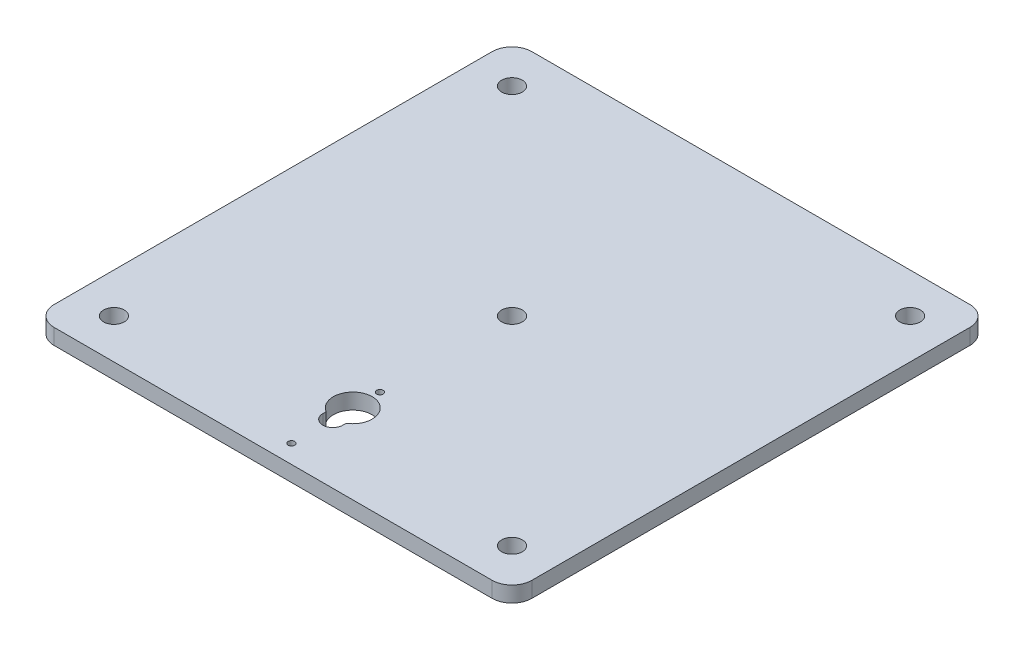
ISO-10303-21;
HEADER;
FILE_DESCRIPTION(('STEP AP214'),'2;1');
FILE_NAME('part.step','',(''),(''),'','','');
FILE_SCHEMA(('AUTOMOTIVE_DESIGN { 1 0 10303 214 1 1 1 1 }'));
ENDSEC;
DATA;
#1=APPLICATION_CONTEXT('core data for automotive mechanical design processes');
#2=APPLICATION_PROTOCOL_DEFINITION('international standard','automotive_design',2000,#1);
#3=PRODUCT_CONTEXT('',#1,'mechanical');
#4=PRODUCT('Part','Part','',(#3));
#5=PRODUCT_RELATED_PRODUCT_CATEGORY('part','',(#4));
#6=PRODUCT_DEFINITION_FORMATION('','',#4);
#7=PRODUCT_DEFINITION_CONTEXT('part definition',#1,'design');
#8=PRODUCT_DEFINITION('design','',#6,#7);
#9=PRODUCT_DEFINITION_SHAPE('','',#8);
#10=(LENGTH_UNIT() NAMED_UNIT(*) SI_UNIT(.MILLI.,.METRE.));
#11=(NAMED_UNIT(*) PLANE_ANGLE_UNIT() SI_UNIT($,.RADIAN.));
#12=(NAMED_UNIT(*) SI_UNIT($,.STERADIAN.) SOLID_ANGLE_UNIT());
#13=UNCERTAINTY_MEASURE_WITH_UNIT(LENGTH_MEASURE(1.E-05),#10,'distance_accuracy_value','');
#14=(GEOMETRIC_REPRESENTATION_CONTEXT(3) GLOBAL_UNCERTAINTY_ASSIGNED_CONTEXT((#13)) GLOBAL_UNIT_ASSIGNED_CONTEXT((#10,
#11,#12)) REPRESENTATION_CONTEXT('',''));
#15=CARTESIAN_POINT('',(0.,0.,0.));
#16=DIRECTION('',(0.,0.,1.));
#17=DIRECTION('',(1.,0.,0.));
#18=AXIS2_PLACEMENT_3D('',#15,#16,#17);
#19=CARTESIAN_POINT('',(-69.85,5.,69.85));
#20=DIRECTION('',(0.,1.,0.));
#21=DIRECTION('',(0.,0.,1.));
#22=AXIS2_PLACEMENT_3D('',#19,#20,#21);
#23=PLANE('',#22);
#24=CARTESIAN_POINT('',(0.,5.,42.125));
#25=DIRECTION('',(0.,1.,0.));
#26=DIRECTION('',(0.,0.,1.));
#27=AXIS2_PLACEMENT_3D('',#24,#25,#26);
#28=CIRCLE('',#27,1.05);
#29=CARTESIAN_POINT('',(0.,5.,43.175));
#30=VERTEX_POINT('',#29);
#31=EDGE_CURVE('E150',#30,#30,#28,.T.);
#32=ORIENTED_EDGE('',*,*,#31,.F.);
#33=EDGE_LOOP('',(#32));
#34=FACE_BOUND('',#33,.T.);
#35=CARTESIAN_POINT('',(-63.5,5.,-63.5));
#36=DIRECTION('',(0.,1.,0.));
#37=DIRECTION('',(0.,0.,-1.));
#38=AXIS2_PLACEMENT_3D('',#35,#36,#37);
#39=CIRCLE('',#38,3.302);
#40=CARTESIAN_POINT('',(-63.5,5.,-66.802));
#41=VERTEX_POINT('',#40);
#42=EDGE_CURVE('E166',#41,#41,#39,.T.);
#43=ORIENTED_EDGE('',*,*,#42,.F.);
#44=EDGE_LOOP('',(#43));
#45=FACE_BOUND('',#44,.T.);
#46=CARTESIAN_POINT('',(63.5000000000001,5.,63.5));
#47=DIRECTION('',(0.,1.,0.));
#48=DIRECTION('',(0.,0.,-1.));
#49=AXIS2_PLACEMENT_3D('',#46,#47,#48);
#50=CIRCLE('',#49,3.302);
#51=CARTESIAN_POINT('',(63.5000000000001,5.,60.198));
#52=VERTEX_POINT('',#51);
#53=EDGE_CURVE('E178',#52,#52,#50,.T.);
#54=ORIENTED_EDGE('',*,*,#53,.F.);
#55=EDGE_LOOP('',(#54));
#56=FACE_BOUND('',#55,.T.);
#57=CARTESIAN_POINT('',(-69.85,5.,69.85));
#58=DIRECTION('',(0.,1.,0.));
#59=DIRECTION('',(0.,0.,1.));
#60=AXIS2_PLACEMENT_3D('',#57,#58,#59);
#61=CIRCLE('',#60,6.34999999999999);
#62=CARTESIAN_POINT('',(-76.2,5.,69.85));
#63=VERTEX_POINT('',#62);
#64=CARTESIAN_POINT('',(-69.85,5.,76.2));
#65=VERTEX_POINT('',#64);
#66=EDGE_CURVE('E190',#63,#65,#61,.T.);
#67=ORIENTED_EDGE('',*,*,#66,.T.);
#68=DIRECTION('',(1.,0.,0.));
#69=VECTOR('',#68,1.);
#70=CARTESIAN_POINT('',(-69.85,5.,76.2));
#71=LINE('',#70,#69);
#72=CARTESIAN_POINT('',(69.85,5.,76.2));
#73=VERTEX_POINT('',#72);
#74=EDGE_CURVE('E193',#65,#73,#71,.T.);
#75=ORIENTED_EDGE('',*,*,#74,.T.);
#76=CARTESIAN_POINT('',(69.85,5.,69.85));
#77=DIRECTION('',(0.,1.,0.));
#78=DIRECTION('',(0.,0.,1.));
#79=AXIS2_PLACEMENT_3D('',#76,#77,#78);
#80=CIRCLE('',#79,6.34999999999999);
#81=CARTESIAN_POINT('',(76.2,5.,69.85));
#82=VERTEX_POINT('',#81);
#83=EDGE_CURVE('E196',#73,#82,#80,.T.);
#84=ORIENTED_EDGE('',*,*,#83,.T.);
#85=DIRECTION('',(0.,0.,-1.));
#86=VECTOR('',#85,1.);
#87=CARTESIAN_POINT('',(76.2,5.,-69.85));
#88=LINE('',#87,#86);
#89=CARTESIAN_POINT('',(76.2,5.,-69.85));
#90=VERTEX_POINT('',#89);
#91=EDGE_CURVE('E198',#82,#90,#88,.T.);
#92=ORIENTED_EDGE('',*,*,#91,.T.);
#93=CARTESIAN_POINT('',(69.85,5.,-69.85));
#94=DIRECTION('',(0.,1.,0.));
#95=DIRECTION('',(0.,0.,-1.));
#96=AXIS2_PLACEMENT_3D('',#93,#94,#95);
#97=CIRCLE('',#96,6.34999999999999);
#98=CARTESIAN_POINT('',(69.8499999999999,5.,-76.2));
#99=VERTEX_POINT('',#98);
#100=EDGE_CURVE('E200',#90,#99,#97,.T.);
#101=ORIENTED_EDGE('',*,*,#100,.T.);
#102=DIRECTION('',(-1.,0.,0.));
#103=VECTOR('',#102,1.);
#104=CARTESIAN_POINT('',(-69.85,5.,-76.2));
#105=LINE('',#104,#103);
#106=CARTESIAN_POINT('',(-69.85,5.,-76.2));
#107=VERTEX_POINT('',#106);
#108=EDGE_CURVE('E202',#99,#107,#105,.T.);
#109=ORIENTED_EDGE('',*,*,#108,.T.);
#110=CARTESIAN_POINT('',(-69.8500000000001,5.,-69.85));
#111=DIRECTION('',(0.,1.,0.));
#112=DIRECTION('',(0.,0.,1.));
#113=AXIS2_PLACEMENT_3D('',#110,#111,#112);
#114=CIRCLE('',#113,6.34999999999999);
#115=CARTESIAN_POINT('',(-76.2,5.,-69.85));
#116=VERTEX_POINT('',#115);
#117=EDGE_CURVE('E204',#107,#116,#114,.T.);
#118=ORIENTED_EDGE('',*,*,#117,.T.);
#119=DIRECTION('',(0.,0.,1.));
#120=VECTOR('',#119,1.);
#121=CARTESIAN_POINT('',(-76.2,5.,-69.85));
#122=LINE('',#121,#120);
#123=EDGE_CURVE('E206',#116,#63,#122,.T.);
#124=ORIENTED_EDGE('',*,*,#123,.T.);
#125=EDGE_LOOP('',(#67,#75,#84,#92,#101,#109,#118,#124));
#126=FACE_BOUND('',#125,.T.);
#127=CARTESIAN_POINT('',(63.5000000000001,5.,-63.5));
#128=DIRECTION('',(0.,1.,0.));
#129=DIRECTION('',(0.,0.,1.));
#130=AXIS2_PLACEMENT_3D('',#127,#128,#129);
#131=CIRCLE('',#130,3.302);
#132=CARTESIAN_POINT('',(63.5000000000001,5.,-60.198));
#133=VERTEX_POINT('',#132);
#134=EDGE_CURVE('E184',#133,#133,#131,.T.);
#135=ORIENTED_EDGE('',*,*,#134,.F.);
#136=EDGE_LOOP('',(#135));
#137=FACE_BOUND('',#136,.T.);
#138=CARTESIAN_POINT('',(-63.5,5.,63.5));
#139=DIRECTION('',(0.,1.,0.));
#140=DIRECTION('',(0.,0.,1.));
#141=AXIS2_PLACEMENT_3D('',#138,#139,#140);
#142=CIRCLE('',#141,3.302);
#143=CARTESIAN_POINT('',(-63.5,5.,66.802));
#144=VERTEX_POINT('',#143);
#145=EDGE_CURVE('E172',#144,#144,#142,.T.);
#146=ORIENTED_EDGE('',*,*,#145,.F.);
#147=EDGE_LOOP('',(#146));
#148=FACE_BOUND('',#147,.T.);
#149=CARTESIAN_POINT('',(0.,5.,0.));
#150=DIRECTION('',(0.,1.,0.));
#151=DIRECTION('',(0.,0.,1.));
#152=AXIS2_PLACEMENT_3D('',#149,#150,#151);
#153=CIRCLE('',#152,3.302);
#154=CARTESIAN_POINT('',(0.,5.,3.30199999999997));
#155=VERTEX_POINT('',#154);
#156=EDGE_CURVE('E160',#155,#155,#153,.T.);
#157=ORIENTED_EDGE('',*,*,#156,.F.);
#158=EDGE_LOOP('',(#157));
#159=FACE_BOUND('',#158,.T.);
#160=DIRECTION('',(0.,0.,1.));
#161=VECTOR('',#160,1.);
#162=CARTESIAN_POINT('',(-3.20000000000003,5.,56.1103672189407));
#163=LINE('',#162,#161);
#164=CARTESIAN_POINT('',(-3.20000000000003,5.,56.1103672189407));
#165=VERTEX_POINT('',#164);
#166=CARTESIAN_POINT('',(-3.20000000000003,5.,57.15));
#167=VERTEX_POINT('',#166);
#168=EDGE_CURVE('E129',#165,#167,#163,.T.);
#169=ORIENTED_EDGE('',*,*,#168,.F.);
#170=CARTESIAN_POINT('',(0.,5.,50.8));
#171=DIRECTION('',(0.,1.,0.));
#172=DIRECTION('',(0.,0.,1.));
#173=AXIS2_PLACEMENT_3D('',#170,#171,#172);
#174=CIRCLE('',#173,6.2);
#175=CARTESIAN_POINT('',(3.19999999999997,5.,56.1103672189407));
#176=VERTEX_POINT('',#175);
#177=EDGE_CURVE('E121',#176,#165,#174,.T.);
#178=ORIENTED_EDGE('',*,*,#177,.F.);
#179=DIRECTION('',(0.,0.,-1.));
#180=VECTOR('',#179,1.);
#181=CARTESIAN_POINT('',(3.19999999999997,5.,56.1103672189407));
#182=LINE('',#181,#180);
#183=CARTESIAN_POINT('',(3.19999999999997,5.,57.15));
#184=VERTEX_POINT('',#183);
#185=EDGE_CURVE('E144',#184,#176,#182,.T.);
#186=ORIENTED_EDGE('',*,*,#185,.F.);
#187=CARTESIAN_POINT('',(0.,5.,57.15));
#188=DIRECTION('',(0.,1.,0.));
#189=DIRECTION('',(0.,0.,1.));
#190=AXIS2_PLACEMENT_3D('',#187,#188,#189);
#191=CIRCLE('',#190,3.2);
#192=EDGE_CURVE('E142',#167,#184,#191,.T.);
#193=ORIENTED_EDGE('',*,*,#192,.F.);
#194=EDGE_LOOP('',(#169,#178,#186,#193));
#195=FACE_BOUND('',#194,.T.);
#196=CARTESIAN_POINT('',(0.,5.,70.375));
#197=DIRECTION('',(0.,1.,0.));
#198=DIRECTION('',(0.,0.,1.));
#199=AXIS2_PLACEMENT_3D('',#196,#197,#198);
#200=CIRCLE('',#199,1.05);
#201=CARTESIAN_POINT('',(0.,5.,71.425));
#202=VERTEX_POINT('',#201);
#203=EDGE_CURVE('E374',#202,#202,#200,.T.);
#204=ORIENTED_EDGE('',*,*,#203,.F.);
#205=EDGE_LOOP('',(#204));
#206=FACE_BOUND('',#205,.T.);
#207=ADVANCED_FACE('F32',(#34,#45,#56,#126,#137,#148,#159,#195,#206),#23,.T.);
#208=CARTESIAN_POINT('',(-69.85,0.,69.85));
#209=DIRECTION('',(0.,1.,0.));
#210=DIRECTION('',(0.,0.,1.));
#211=AXIS2_PLACEMENT_3D('',#208,#209,#210);
#212=PLANE('',#211);
#213=CARTESIAN_POINT('',(0.,0.,0.));
#214=DIRECTION('',(0.,1.,0.));
#215=DIRECTION('',(0.,0.,1.));
#216=AXIS2_PLACEMENT_3D('',#213,#214,#215);
#217=CIRCLE('',#216,3.302);
#218=CARTESIAN_POINT('',(0.,0.,3.30199999999997));
#219=VERTEX_POINT('',#218);
#220=EDGE_CURVE('E137',#219,#219,#217,.T.);
#221=ORIENTED_EDGE('',*,*,#220,.T.);
#222=EDGE_LOOP('',(#221));
#223=FACE_BOUND('',#222,.T.);
#224=CARTESIAN_POINT('',(-63.5,0.,-63.5));
#225=DIRECTION('',(0.,1.,0.));
#226=DIRECTION('',(0.,0.,-1.));
#227=AXIS2_PLACEMENT_3D('',#224,#225,#226);
#228=CIRCLE('',#227,3.302);
#229=CARTESIAN_POINT('',(-63.5,0.,-66.802));
#230=VERTEX_POINT('',#229);
#231=EDGE_CURVE('E163',#230,#230,#228,.T.);
#232=ORIENTED_EDGE('',*,*,#231,.T.);
#233=EDGE_LOOP('',(#232));
#234=FACE_BOUND('',#233,.T.);
#235=CARTESIAN_POINT('',(-63.5,0.,63.5));
#236=DIRECTION('',(0.,1.,0.));
#237=DIRECTION('',(0.,0.,1.));
#238=AXIS2_PLACEMENT_3D('',#235,#236,#237);
#239=CIRCLE('',#238,3.302);
#240=CARTESIAN_POINT('',(-63.5,0.,66.802));
#241=VERTEX_POINT('',#240);
#242=EDGE_CURVE('E169',#241,#241,#239,.T.);
#243=ORIENTED_EDGE('',*,*,#242,.T.);
#244=EDGE_LOOP('',(#243));
#245=FACE_BOUND('',#244,.T.);
#246=CARTESIAN_POINT('',(63.5000000000001,0.,63.5));
#247=DIRECTION('',(0.,1.,0.));
#248=DIRECTION('',(0.,0.,-1.));
#249=AXIS2_PLACEMENT_3D('',#246,#247,#248);
#250=CIRCLE('',#249,3.302);
#251=CARTESIAN_POINT('',(63.5000000000001,0.,60.198));
#252=VERTEX_POINT('',#251);
#253=EDGE_CURVE('E175',#252,#252,#250,.T.);
#254=ORIENTED_EDGE('',*,*,#253,.T.);
#255=EDGE_LOOP('',(#254));
#256=FACE_BOUND('',#255,.T.);
#257=CARTESIAN_POINT('',(63.5000000000001,0.,-63.5));
#258=DIRECTION('',(0.,1.,0.));
#259=DIRECTION('',(0.,0.,1.));
#260=AXIS2_PLACEMENT_3D('',#257,#258,#259);
#261=CIRCLE('',#260,3.302);
#262=CARTESIAN_POINT('',(63.5000000000001,0.,-60.198));
#263=VERTEX_POINT('',#262);
#264=EDGE_CURVE('E181',#263,#263,#261,.T.);
#265=ORIENTED_EDGE('',*,*,#264,.T.);
#266=EDGE_LOOP('',(#265));
#267=FACE_BOUND('',#266,.T.);
#268=CARTESIAN_POINT('',(-69.85,0.,69.85));
#269=DIRECTION('',(0.,1.,0.));
#270=DIRECTION('',(0.,0.,1.));
#271=AXIS2_PLACEMENT_3D('',#268,#269,#270);
#272=CIRCLE('',#271,6.34999999999999);
#273=CARTESIAN_POINT('',(-76.2,0.,69.85));
#274=VERTEX_POINT('',#273);
#275=CARTESIAN_POINT('',(-69.85,0.,76.2));
#276=VERTEX_POINT('',#275);
#277=EDGE_CURVE('E187',#274,#276,#272,.T.);
#278=ORIENTED_EDGE('',*,*,#277,.F.);
#279=DIRECTION('',(0.,0.,1.));
#280=VECTOR('',#279,1.);
#281=CARTESIAN_POINT('',(-76.2,0.,-69.85));
#282=LINE('',#281,#280);
#283=CARTESIAN_POINT('',(-76.2,0.,-69.85));
#284=VERTEX_POINT('',#283);
#285=EDGE_CURVE('E194',#284,#274,#282,.T.);
#286=ORIENTED_EDGE('',*,*,#285,.F.);
#287=CARTESIAN_POINT('',(-69.8500000000001,0.,-69.85));
#288=DIRECTION('',(0.,1.,0.));
#289=DIRECTION('',(0.,0.,1.));
#290=AXIS2_PLACEMENT_3D('',#287,#288,#289);
#291=CIRCLE('',#290,6.34999999999999);
#292=CARTESIAN_POINT('',(-69.85,0.,-76.2));
#293=VERTEX_POINT('',#292);
#294=EDGE_CURVE('E221',#293,#284,#291,.T.);
#295=ORIENTED_EDGE('',*,*,#294,.F.);
#296=DIRECTION('',(-1.,0.,0.));
#297=VECTOR('',#296,1.);
#298=CARTESIAN_POINT('',(-69.85,0.,-76.2));
#299=LINE('',#298,#297);
#300=CARTESIAN_POINT('',(69.8499999999999,0.,-76.2));
#301=VERTEX_POINT('',#300);
#302=EDGE_CURVE('E219',#301,#293,#299,.T.);
#303=ORIENTED_EDGE('',*,*,#302,.F.);
#304=CARTESIAN_POINT('',(69.85,0.,-69.85));
#305=DIRECTION('',(0.,1.,0.));
#306=DIRECTION('',(0.,0.,-1.));
#307=AXIS2_PLACEMENT_3D('',#304,#305,#306);
#308=CIRCLE('',#307,6.34999999999999);
#309=CARTESIAN_POINT('',(76.2,0.,-69.85));
#310=VERTEX_POINT('',#309);
#311=EDGE_CURVE('E217',#310,#301,#308,.T.);
#312=ORIENTED_EDGE('',*,*,#311,.F.);
#313=DIRECTION('',(0.,0.,-1.));
#314=VECTOR('',#313,1.);
#315=CARTESIAN_POINT('',(76.2,0.,-69.85));
#316=LINE('',#315,#314);
#317=CARTESIAN_POINT('',(76.2,0.,69.85));
#318=VERTEX_POINT('',#317);
#319=EDGE_CURVE('E215',#318,#310,#316,.T.);
#320=ORIENTED_EDGE('',*,*,#319,.F.);
#321=CARTESIAN_POINT('',(69.85,0.,69.85));
#322=DIRECTION('',(0.,1.,0.));
#323=DIRECTION('',(0.,0.,1.));
#324=AXIS2_PLACEMENT_3D('',#321,#322,#323);
#325=CIRCLE('',#324,6.34999999999999);
#326=CARTESIAN_POINT('',(69.85,0.,76.2));
#327=VERTEX_POINT('',#326);
#328=EDGE_CURVE('E213',#327,#318,#325,.T.);
#329=ORIENTED_EDGE('',*,*,#328,.F.);
#330=DIRECTION('',(1.,0.,0.));
#331=VECTOR('',#330,1.);
#332=CARTESIAN_POINT('',(-69.85,0.,76.2));
#333=LINE('',#332,#331);
#334=EDGE_CURVE('E211',#276,#327,#333,.T.);
#335=ORIENTED_EDGE('',*,*,#334,.F.);
#336=EDGE_LOOP('',(#278,#286,#295,#303,#312,#320,#329,#335));
#337=FACE_BOUND('',#336,.T.);
#338=CARTESIAN_POINT('',(0.,0.,50.8));
#339=DIRECTION('',(0.,1.,0.));
#340=DIRECTION('',(0.,0.,1.));
#341=AXIS2_PLACEMENT_3D('',#338,#339,#340);
#342=CIRCLE('',#341,6.2);
#343=CARTESIAN_POINT('',(3.19999999999997,0.,56.1103672189407));
#344=VERTEX_POINT('',#343);
#345=CARTESIAN_POINT('',(-3.20000000000003,0.,56.1103672189407));
#346=VERTEX_POINT('',#345);
#347=EDGE_CURVE('E55',#344,#346,#342,.T.);
#348=ORIENTED_EDGE('',*,*,#347,.T.);
#349=DIRECTION('',(0.,0.,1.));
#350=VECTOR('',#349,1.);
#351=CARTESIAN_POINT('',(-3.20000000000003,0.,56.1103672189407));
#352=LINE('',#351,#350);
#353=CARTESIAN_POINT('',(-3.20000000000003,0.,57.15));
#354=VERTEX_POINT('',#353);
#355=EDGE_CURVE('E136',#346,#354,#352,.T.);
#356=ORIENTED_EDGE('',*,*,#355,.T.);
#357=CARTESIAN_POINT('',(0.,0.,57.15));
#358=DIRECTION('',(0.,1.,0.));
#359=DIRECTION('',(0.,0.,1.));
#360=AXIS2_PLACEMENT_3D('',#357,#358,#359);
#361=CIRCLE('',#360,3.2);
#362=CARTESIAN_POINT('',(3.19999999999997,0.,57.15));
#363=VERTEX_POINT('',#362);
#364=EDGE_CURVE('E152',#354,#363,#361,.T.);
#365=ORIENTED_EDGE('',*,*,#364,.T.);
#366=DIRECTION('',(0.,0.,-1.));
#367=VECTOR('',#366,1.);
#368=CARTESIAN_POINT('',(3.19999999999997,0.,56.1103672189407));
#369=LINE('',#368,#367);
#370=EDGE_CURVE('E130',#363,#344,#369,.T.);
#371=ORIENTED_EDGE('',*,*,#370,.T.);
#372=EDGE_LOOP('',(#348,#356,#365,#371));
#373=FACE_BOUND('',#372,.T.);
#374=CARTESIAN_POINT('',(0.,0.,42.125));
#375=DIRECTION('',(0.,1.,0.));
#376=DIRECTION('',(0.,0.,1.));
#377=AXIS2_PLACEMENT_3D('',#374,#375,#376);
#378=CIRCLE('',#377,1.05);
#379=CARTESIAN_POINT('',(0.,0.,43.175));
#380=VERTEX_POINT('',#379);
#381=EDGE_CURVE('E372',#380,#380,#378,.T.);
#382=ORIENTED_EDGE('',*,*,#381,.T.);
#383=EDGE_LOOP('',(#382));
#384=FACE_BOUND('',#383,.T.);
#385=CARTESIAN_POINT('',(0.,0.,70.375));
#386=DIRECTION('',(0.,1.,0.));
#387=DIRECTION('',(0.,0.,1.));
#388=AXIS2_PLACEMENT_3D('',#385,#386,#387);
#389=CIRCLE('',#388,1.05);
#390=CARTESIAN_POINT('',(0.,0.,71.425));
#391=VERTEX_POINT('',#390);
#392=EDGE_CURVE('E378',#391,#391,#389,.T.);
#393=ORIENTED_EDGE('',*,*,#392,.T.);
#394=EDGE_LOOP('',(#393));
#395=FACE_BOUND('',#394,.T.);
#396=ADVANCED_FACE('F251',(#223,#234,#245,#256,#267,#337,#373,#384,#395),#212,.F.);
#397=CARTESIAN_POINT('',(-69.85,5.,69.85));
#398=DIRECTION('',(0.,-1.,0.));
#399=DIRECTION('',(0.,0.,-1.));
#400=AXIS2_PLACEMENT_3D('',#397,#398,#399);
#401=CYLINDRICAL_SURFACE('',#400,6.34999999999999);
#402=ORIENTED_EDGE('',*,*,#277,.T.);
#403=DIRECTION('',(0.,-1.,0.));
#404=VECTOR('',#403,1.);
#405=CARTESIAN_POINT('',(-69.85,5.,76.2));
#406=LINE('',#405,#404);
#407=EDGE_CURVE('E11',#65,#276,#406,.T.);
#408=ORIENTED_EDGE('',*,*,#407,.F.);
#409=ORIENTED_EDGE('',*,*,#66,.F.);
#410=DIRECTION('',(0.,-1.,0.));
#411=VECTOR('',#410,1.);
#412=CARTESIAN_POINT('',(-76.2,5.,69.85));
#413=LINE('',#412,#411);
#414=EDGE_CURVE('E208',#63,#274,#413,.T.);
#415=ORIENTED_EDGE('',*,*,#414,.T.);
#416=EDGE_LOOP('',(#402,#408,#409,#415));
#417=FACE_BOUND('',#416,.T.);
#418=ADVANCED_FACE('F34',(#417),#401,.T.);
#419=CARTESIAN_POINT('',(-69.85,5.,76.2));
#420=DIRECTION('',(0.,0.,-1.));
#421=DIRECTION('',(-1.,0.,0.));
#422=AXIS2_PLACEMENT_3D('',#419,#420,#421);
#423=PLANE('',#422);
#424=ORIENTED_EDGE('',*,*,#334,.T.);
#425=DIRECTION('',(0.,-1.,0.));
#426=VECTOR('',#425,1.);
#427=CARTESIAN_POINT('',(69.85,5.,76.2));
#428=LINE('',#427,#426);
#429=EDGE_CURVE('E40',#73,#327,#428,.T.);
#430=ORIENTED_EDGE('',*,*,#429,.F.);
#431=ORIENTED_EDGE('',*,*,#74,.F.);
#432=ORIENTED_EDGE('',*,*,#407,.T.);
#433=EDGE_LOOP('',(#424,#430,#431,#432));
#434=FACE_BOUND('',#433,.T.);
#435=ADVANCED_FACE('F269',(#434),#423,.F.);
#436=CARTESIAN_POINT('',(69.85,5.,69.85));
#437=DIRECTION('',(0.,-1.,0.));
#438=DIRECTION('',(0.,0.,-1.));
#439=AXIS2_PLACEMENT_3D('',#436,#437,#438);
#440=CYLINDRICAL_SURFACE('',#439,6.34999999999999);
#441=ORIENTED_EDGE('',*,*,#328,.T.);
#442=DIRECTION('',(0.,-1.,0.));
#443=VECTOR('',#442,1.);
#444=CARTESIAN_POINT('',(76.2,5.,69.85));
#445=LINE('',#444,#443);
#446=EDGE_CURVE('E238',#82,#318,#445,.T.);
#447=ORIENTED_EDGE('',*,*,#446,.F.);
#448=ORIENTED_EDGE('',*,*,#83,.F.);
#449=ORIENTED_EDGE('',*,*,#429,.T.);
#450=EDGE_LOOP('',(#441,#447,#448,#449));
#451=FACE_BOUND('',#450,.T.);
#452=ADVANCED_FACE('F245',(#451),#440,.T.);
#453=CARTESIAN_POINT('',(76.2,5.,-69.85));
#454=DIRECTION('',(-1.,0.,0.));
#455=DIRECTION('',(0.,0.,1.));
#456=AXIS2_PLACEMENT_3D('',#453,#454,#455);
#457=PLANE('',#456);
#458=ORIENTED_EDGE('',*,*,#319,.T.);
#459=DIRECTION('',(0.,-1.,0.));
#460=VECTOR('',#459,1.);
#461=CARTESIAN_POINT('',(76.2,5.,-69.85));
#462=LINE('',#461,#460);
#463=EDGE_CURVE('E235',#90,#310,#462,.T.);
#464=ORIENTED_EDGE('',*,*,#463,.F.);
#465=ORIENTED_EDGE('',*,*,#91,.F.);
#466=ORIENTED_EDGE('',*,*,#446,.T.);
#467=EDGE_LOOP('',(#458,#464,#465,#466));
#468=FACE_BOUND('',#467,.T.);
#469=ADVANCED_FACE('F257',(#468),#457,.F.);
#470=CARTESIAN_POINT('',(69.85,5.,-69.85));
#471=DIRECTION('',(0.,-1.,0.));
#472=DIRECTION('',(0.,0.,-1.));
#473=AXIS2_PLACEMENT_3D('',#470,#471,#472);
#474=CYLINDRICAL_SURFACE('',#473,6.34999999999999);
#475=ORIENTED_EDGE('',*,*,#311,.T.);
#476=DIRECTION('',(0.,-1.,0.));
#477=VECTOR('',#476,1.);
#478=CARTESIAN_POINT('',(69.8499999999999,5.,-76.2));
#479=LINE('',#478,#477);
#480=EDGE_CURVE('E232',#99,#301,#479,.T.);
#481=ORIENTED_EDGE('',*,*,#480,.F.);
#482=ORIENTED_EDGE('',*,*,#100,.F.);
#483=ORIENTED_EDGE('',*,*,#463,.T.);
#484=EDGE_LOOP('',(#475,#481,#482,#483));
#485=FACE_BOUND('',#484,.T.);
#486=ADVANCED_FACE('F261',(#485),#474,.T.);
#487=CARTESIAN_POINT('',(-69.85,5.,-76.2));
#488=DIRECTION('',(0.,0.,1.));
#489=DIRECTION('',(1.,0.,0.));
#490=AXIS2_PLACEMENT_3D('',#487,#488,#489);
#491=PLANE('',#490);
#492=ORIENTED_EDGE('',*,*,#302,.T.);
#493=DIRECTION('',(0.,-1.,0.));
#494=VECTOR('',#493,1.);
#495=CARTESIAN_POINT('',(-69.85,5.,-76.2));
#496=LINE('',#495,#494);
#497=EDGE_CURVE('E229',#107,#293,#496,.T.);
#498=ORIENTED_EDGE('',*,*,#497,.F.);
#499=ORIENTED_EDGE('',*,*,#108,.F.);
#500=ORIENTED_EDGE('',*,*,#480,.T.);
#501=EDGE_LOOP('',(#492,#498,#499,#500));
#502=FACE_BOUND('',#501,.T.);
#503=ADVANCED_FACE('F282',(#502),#491,.F.);
#504=CARTESIAN_POINT('',(-69.8500000000001,5.,-69.85));
#505=DIRECTION('',(0.,-1.,0.));
#506=DIRECTION('',(0.,0.,-1.));
#507=AXIS2_PLACEMENT_3D('',#504,#505,#506);
#508=CYLINDRICAL_SURFACE('',#507,6.34999999999999);
#509=ORIENTED_EDGE('',*,*,#294,.T.);
#510=DIRECTION('',(0.,-1.,0.));
#511=VECTOR('',#510,1.);
#512=CARTESIAN_POINT('',(-76.2,5.,-69.85));
#513=LINE('',#512,#511);
#514=EDGE_CURVE('E226',#116,#284,#513,.T.);
#515=ORIENTED_EDGE('',*,*,#514,.F.);
#516=ORIENTED_EDGE('',*,*,#117,.F.);
#517=ORIENTED_EDGE('',*,*,#497,.T.);
#518=EDGE_LOOP('',(#509,#515,#516,#517));
#519=FACE_BOUND('',#518,.T.);
#520=ADVANCED_FACE('F280',(#519),#508,.T.);
#521=CARTESIAN_POINT('',(-76.2,5.,-69.85));
#522=DIRECTION('',(1.,0.,0.));
#523=DIRECTION('',(0.,0.,-1.));
#524=AXIS2_PLACEMENT_3D('',#521,#522,#523);
#525=PLANE('',#524);
#526=ORIENTED_EDGE('',*,*,#285,.T.);
#527=ORIENTED_EDGE('',*,*,#414,.F.);
#528=ORIENTED_EDGE('',*,*,#123,.F.);
#529=ORIENTED_EDGE('',*,*,#514,.T.);
#530=EDGE_LOOP('',(#526,#527,#528,#529));
#531=FACE_BOUND('',#530,.T.);
#532=ADVANCED_FACE('F275',(#531),#525,.F.);
#533=CARTESIAN_POINT('',(63.5000000000001,5.,-63.5));
#534=DIRECTION('',(0.,-1.,0.));
#535=DIRECTION('',(0.,0.,-1.));
#536=AXIS2_PLACEMENT_3D('',#533,#534,#535);
#537=CYLINDRICAL_SURFACE('',#536,3.302);
#538=ORIENTED_EDGE('',*,*,#134,.T.);
#539=EDGE_LOOP('',(#538));
#540=FACE_BOUND('',#539,.T.);
#541=ORIENTED_EDGE('',*,*,#264,.F.);
#542=EDGE_LOOP('',(#541));
#543=FACE_BOUND('',#542,.T.);
#544=ADVANCED_FACE('F302',(#540,#543),#537,.F.);
#545=CARTESIAN_POINT('',(63.5000000000001,5.,63.5));
#546=DIRECTION('',(0.,-1.,0.));
#547=DIRECTION('',(0.,0.,-1.));
#548=AXIS2_PLACEMENT_3D('',#545,#546,#547);
#549=CYLINDRICAL_SURFACE('',#548,3.302);
#550=ORIENTED_EDGE('',*,*,#53,.T.);
#551=EDGE_LOOP('',(#550));
#552=FACE_BOUND('',#551,.T.);
#553=ORIENTED_EDGE('',*,*,#253,.F.);
#554=EDGE_LOOP('',(#553));
#555=FACE_BOUND('',#554,.T.);
#556=ADVANCED_FACE('F309',(#552,#555),#549,.F.);
#557=CARTESIAN_POINT('',(-63.5,5.,63.5));
#558=DIRECTION('',(0.,-1.,0.));
#559=DIRECTION('',(0.,0.,-1.));
#560=AXIS2_PLACEMENT_3D('',#557,#558,#559);
#561=CYLINDRICAL_SURFACE('',#560,3.302);
#562=ORIENTED_EDGE('',*,*,#145,.T.);
#563=EDGE_LOOP('',(#562));
#564=FACE_BOUND('',#563,.T.);
#565=ORIENTED_EDGE('',*,*,#242,.F.);
#566=EDGE_LOOP('',(#565));
#567=FACE_BOUND('',#566,.T.);
#568=ADVANCED_FACE('F314',(#564,#567),#561,.F.);
#569=CARTESIAN_POINT('',(-63.5,5.,-63.5));
#570=DIRECTION('',(0.,-1.,0.));
#571=DIRECTION('',(0.,0.,-1.));
#572=AXIS2_PLACEMENT_3D('',#569,#570,#571);
#573=CYLINDRICAL_SURFACE('',#572,3.302);
#574=ORIENTED_EDGE('',*,*,#42,.T.);
#575=EDGE_LOOP('',(#574));
#576=FACE_BOUND('',#575,.T.);
#577=ORIENTED_EDGE('',*,*,#231,.F.);
#578=EDGE_LOOP('',(#577));
#579=FACE_BOUND('',#578,.T.);
#580=ADVANCED_FACE('F328',(#576,#579),#573,.F.);
#581=CARTESIAN_POINT('',(0.,5.,0.));
#582=DIRECTION('',(0.,-1.,0.));
#583=DIRECTION('',(0.,0.,-1.));
#584=AXIS2_PLACEMENT_3D('',#581,#582,#583);
#585=CYLINDRICAL_SURFACE('',#584,3.302);
#586=ORIENTED_EDGE('',*,*,#156,.T.);
#587=EDGE_LOOP('',(#586));
#588=FACE_BOUND('',#587,.T.);
#589=ORIENTED_EDGE('',*,*,#220,.F.);
#590=EDGE_LOOP('',(#589));
#591=FACE_BOUND('',#590,.T.);
#592=ADVANCED_FACE('F325',(#588,#591),#585,.F.);
#593=CARTESIAN_POINT('',(0.,5.,50.8));
#594=DIRECTION('',(0.,-1.,0.));
#595=DIRECTION('',(0.,0.,-1.));
#596=AXIS2_PLACEMENT_3D('',#593,#594,#595);
#597=CYLINDRICAL_SURFACE('',#596,6.2);
#598=ORIENTED_EDGE('',*,*,#347,.F.);
#599=DIRECTION('',(0.,-1.,0.));
#600=VECTOR('',#599,1.);
#601=CARTESIAN_POINT('',(3.19999999999997,5.,56.1103672189407));
#602=LINE('',#601,#600);
#603=EDGE_CURVE('E125',#176,#344,#602,.T.);
#604=ORIENTED_EDGE('',*,*,#603,.F.);
#605=ORIENTED_EDGE('',*,*,#177,.T.);
#606=DIRECTION('',(0.,-1.,0.));
#607=VECTOR('',#606,1.);
#608=CARTESIAN_POINT('',(-3.20000000000003,5.,56.1103672189407));
#609=LINE('',#608,#607);
#610=EDGE_CURVE('E124',#165,#346,#609,.T.);
#611=ORIENTED_EDGE('',*,*,#610,.T.);
#612=EDGE_LOOP('',(#598,#604,#605,#611));
#613=FACE_BOUND('',#612,.T.);
#614=ADVANCED_FACE('F123',(#613),#597,.F.);
#615=CARTESIAN_POINT('',(-3.20000000000003,5.,56.1103672189407));
#616=DIRECTION('',(1.,0.,0.));
#617=DIRECTION('',(0.,0.,-1.));
#618=AXIS2_PLACEMENT_3D('',#615,#616,#617);
#619=PLANE('',#618);
#620=ORIENTED_EDGE('',*,*,#355,.F.);
#621=ORIENTED_EDGE('',*,*,#610,.F.);
#622=ORIENTED_EDGE('',*,*,#168,.T.);
#623=DIRECTION('',(0.,-1.,0.));
#624=VECTOR('',#623,1.);
#625=CARTESIAN_POINT('',(-3.20000000000003,5.,57.15));
#626=LINE('',#625,#624);
#627=EDGE_CURVE('E138',#167,#354,#626,.T.);
#628=ORIENTED_EDGE('',*,*,#627,.T.);
#629=EDGE_LOOP('',(#620,#621,#622,#628));
#630=FACE_BOUND('',#629,.T.);
#631=ADVANCED_FACE('F133',(#630),#619,.T.);
#632=CARTESIAN_POINT('',(0.,5.,57.15));
#633=DIRECTION('',(0.,-1.,0.));
#634=DIRECTION('',(0.,0.,-1.));
#635=AXIS2_PLACEMENT_3D('',#632,#633,#634);
#636=CYLINDRICAL_SURFACE('',#635,3.2);
#637=ORIENTED_EDGE('',*,*,#364,.F.);
#638=ORIENTED_EDGE('',*,*,#627,.F.);
#639=ORIENTED_EDGE('',*,*,#192,.T.);
#640=DIRECTION('',(0.,-1.,0.));
#641=VECTOR('',#640,1.);
#642=CARTESIAN_POINT('',(3.19999999999997,5.,57.15));
#643=LINE('',#642,#641);
#644=EDGE_CURVE('E47',#184,#363,#643,.T.);
#645=ORIENTED_EDGE('',*,*,#644,.T.);
#646=EDGE_LOOP('',(#637,#638,#639,#645));
#647=FACE_BOUND('',#646,.T.);
#648=ADVANCED_FACE('F352',(#647),#636,.F.);
#649=CARTESIAN_POINT('',(3.19999999999997,5.,56.1103672189407));
#650=DIRECTION('',(-1.,0.,0.));
#651=DIRECTION('',(0.,0.,1.));
#652=AXIS2_PLACEMENT_3D('',#649,#650,#651);
#653=PLANE('',#652);
#654=ORIENTED_EDGE('',*,*,#370,.F.);
#655=ORIENTED_EDGE('',*,*,#644,.F.);
#656=ORIENTED_EDGE('',*,*,#185,.T.);
#657=ORIENTED_EDGE('',*,*,#603,.T.);
#658=EDGE_LOOP('',(#654,#655,#656,#657));
#659=FACE_BOUND('',#658,.T.);
#660=ADVANCED_FACE('F355',(#659),#653,.T.);
#661=CARTESIAN_POINT('',(0.,5.,42.125));
#662=DIRECTION('',(0.,-1.,0.));
#663=DIRECTION('',(0.,0.,-1.));
#664=AXIS2_PLACEMENT_3D('',#661,#662,#663);
#665=CYLINDRICAL_SURFACE('',#664,1.05);
#666=ORIENTED_EDGE('',*,*,#31,.T.);
#667=EDGE_LOOP('',(#666));
#668=FACE_BOUND('',#667,.T.);
#669=ORIENTED_EDGE('',*,*,#381,.F.);
#670=EDGE_LOOP('',(#669));
#671=FACE_BOUND('',#670,.T.);
#672=ADVANCED_FACE('F359',(#668,#671),#665,.F.);
#673=CARTESIAN_POINT('',(0.,5.,70.375));
#674=DIRECTION('',(0.,-1.,0.));
#675=DIRECTION('',(0.,0.,-1.));
#676=AXIS2_PLACEMENT_3D('',#673,#674,#675);
#677=CYLINDRICAL_SURFACE('',#676,1.05);
#678=ORIENTED_EDGE('',*,*,#203,.T.);
#679=EDGE_LOOP('',(#678));
#680=FACE_BOUND('',#679,.T.);
#681=ORIENTED_EDGE('',*,*,#392,.F.);
#682=EDGE_LOOP('',(#681));
#683=FACE_BOUND('',#682,.T.);
#684=ADVANCED_FACE('F360',(#680,#683),#677,.F.);
#685=CLOSED_SHELL('',(#207,#396,#418,#435,#452,#469,#486,#503,#520,#532,#544,#556,#568,#580,
#592,#614,#631,#648,#660,#672,#684));
#686=MANIFOLD_SOLID_BREP('B2',#685);
#687=ADVANCED_BREP_SHAPE_REPRESENTATION('',(#18,#686),#14);
#688=SHAPE_DEFINITION_REPRESENTATION(#9,#687);
ENDSEC;
END-ISO-10303-21;
